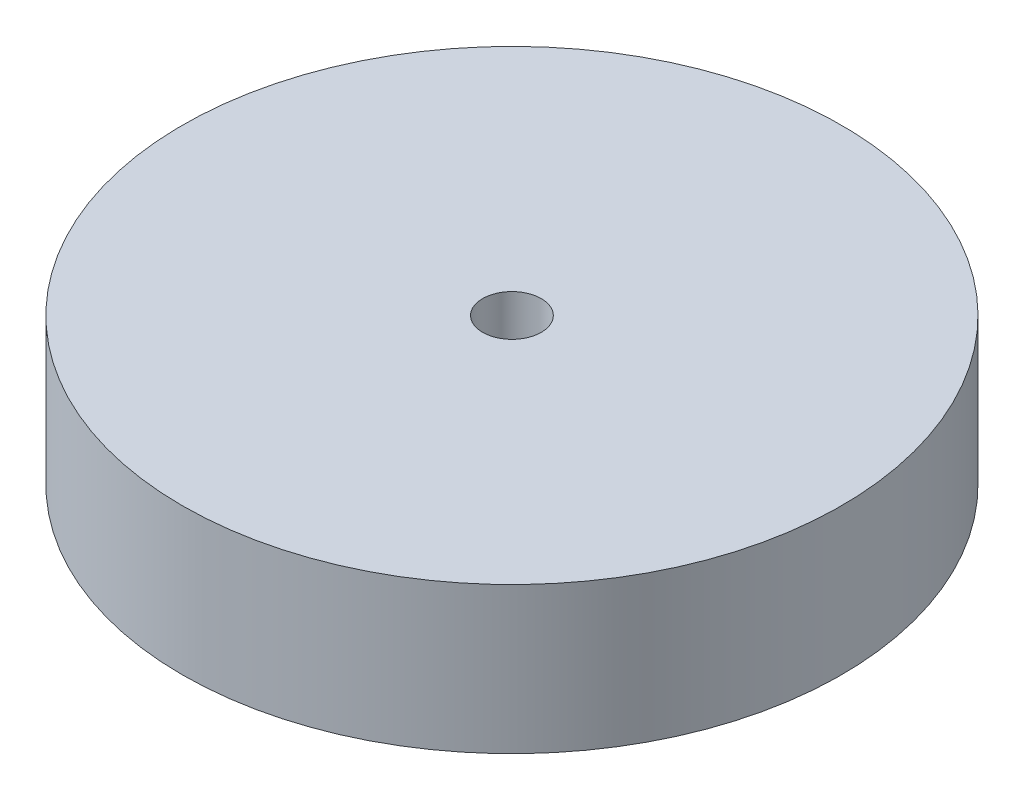
ISO-10303-21;
HEADER;
FILE_DESCRIPTION(('STEP AP214'),'2;1');
FILE_NAME('part.step','',(''),(''),'','','');
FILE_SCHEMA(('AUTOMOTIVE_DESIGN { 1 0 10303 214 1 1 1 1 }'));
ENDSEC;
DATA;
#1=APPLICATION_CONTEXT('core data for automotive mechanical design processes');
#2=APPLICATION_PROTOCOL_DEFINITION('international standard','automotive_design',2000,#1);
#3=PRODUCT_CONTEXT('',#1,'mechanical');
#4=PRODUCT('Part','Part','',(#3));
#5=PRODUCT_RELATED_PRODUCT_CATEGORY('part','',(#4));
#6=PRODUCT_DEFINITION_FORMATION('','',#4);
#7=PRODUCT_DEFINITION_CONTEXT('part definition',#1,'design');
#8=PRODUCT_DEFINITION('design','',#6,#7);
#9=PRODUCT_DEFINITION_SHAPE('','',#8);
#10=(LENGTH_UNIT() NAMED_UNIT(*) SI_UNIT(.MILLI.,.METRE.));
#11=(NAMED_UNIT(*) PLANE_ANGLE_UNIT() SI_UNIT($,.RADIAN.));
#12=(NAMED_UNIT(*) SI_UNIT($,.STERADIAN.) SOLID_ANGLE_UNIT());
#13=UNCERTAINTY_MEASURE_WITH_UNIT(LENGTH_MEASURE(1.E-05),#10,'distance_accuracy_value','');
#14=(GEOMETRIC_REPRESENTATION_CONTEXT(3) GLOBAL_UNCERTAINTY_ASSIGNED_CONTEXT((#13)) GLOBAL_UNIT_ASSIGNED_CONTEXT((#10,
#11,#12)) REPRESENTATION_CONTEXT('',''));
#15=CARTESIAN_POINT('',(0.,0.,0.));
#16=DIRECTION('',(0.,0.,1.));
#17=DIRECTION('',(1.,0.,0.));
#18=AXIS2_PLACEMENT_3D('',#15,#16,#17);
#19=CARTESIAN_POINT('',(0.,20.,0.));
#20=DIRECTION('',(0.,-1.,0.));
#21=DIRECTION('',(0.,0.,-1.));
#22=AXIS2_PLACEMENT_3D('',#19,#20,#21);
#23=CYLINDRICAL_SURFACE('',#22,45.);
#24=CARTESIAN_POINT('',(0.,20.,0.));
#25=DIRECTION('',(0.,1.,0.));
#26=DIRECTION('',(0.,0.,1.));
#27=AXIS2_PLACEMENT_3D('',#24,#25,#26);
#28=CIRCLE('',#27,45.);
#29=CARTESIAN_POINT('',(0.,20.,45.));
#30=VERTEX_POINT('',#29);
#31=EDGE_CURVE('E10',#30,#30,#28,.T.);
#32=ORIENTED_EDGE('',*,*,#31,.F.);
#33=EDGE_LOOP('',(#32));
#34=FACE_BOUND('',#33,.T.);
#35=CARTESIAN_POINT('',(0.,0.,0.));
#36=DIRECTION('',(0.,1.,0.));
#37=DIRECTION('',(0.,0.,1.));
#38=AXIS2_PLACEMENT_3D('',#35,#36,#37);
#39=CIRCLE('',#38,45.);
#40=CARTESIAN_POINT('',(0.,0.,45.));
#41=VERTEX_POINT('',#40);
#42=EDGE_CURVE('E34',#41,#41,#39,.T.);
#43=ORIENTED_EDGE('',*,*,#42,.T.);
#44=EDGE_LOOP('',(#43));
#45=FACE_BOUND('',#44,.T.);
#46=ADVANCED_FACE('F31',(#34,#45),#23,.T.);
#47=CARTESIAN_POINT('',(0.,20.,0.));
#48=DIRECTION('',(0.,1.,0.));
#49=DIRECTION('',(0.,0.,1.));
#50=AXIS2_PLACEMENT_3D('',#47,#48,#49);
#51=PLANE('',#50);
#52=CARTESIAN_POINT('',(0.,20.,0.));
#53=DIRECTION('',(0.,1.,0.));
#54=DIRECTION('',(0.,0.,1.));
#55=AXIS2_PLACEMENT_3D('',#52,#53,#54);
#56=CIRCLE('',#55,4.);
#57=CARTESIAN_POINT('',(0.,20.,4.));
#58=VERTEX_POINT('',#57);
#59=EDGE_CURVE('E45',#58,#58,#56,.T.);
#60=ORIENTED_EDGE('',*,*,#59,.F.);
#61=EDGE_LOOP('',(#60));
#62=FACE_BOUND('',#61,.T.);
#63=ORIENTED_EDGE('',*,*,#31,.T.);
#64=EDGE_LOOP('',(#63));
#65=FACE_BOUND('',#64,.T.);
#66=ADVANCED_FACE('F52',(#62,#65),#51,.T.);
#67=CARTESIAN_POINT('',(0.,0.,0.));
#68=DIRECTION('',(0.,1.,0.));
#69=DIRECTION('',(0.,0.,1.));
#70=AXIS2_PLACEMENT_3D('',#67,#68,#69);
#71=PLANE('',#70);
#72=CARTESIAN_POINT('',(0.,0.,0.));
#73=DIRECTION('',(0.,1.,0.));
#74=DIRECTION('',(0.,0.,1.));
#75=AXIS2_PLACEMENT_3D('',#72,#73,#74);
#76=CIRCLE('',#75,4.);
#77=CARTESIAN_POINT('',(0.,0.,4.));
#78=VERTEX_POINT('',#77);
#79=EDGE_CURVE('E41',#78,#78,#76,.F.);
#80=ORIENTED_EDGE('',*,*,#79,.F.);
#81=EDGE_LOOP('',(#80));
#82=FACE_BOUND('',#81,.T.);
#83=ORIENTED_EDGE('',*,*,#42,.F.);
#84=EDGE_LOOP('',(#83));
#85=FACE_BOUND('',#84,.T.);
#86=ADVANCED_FACE('F54',(#82,#85),#71,.F.);
#87=CARTESIAN_POINT('',(0.,-0.001000000000001,0.));
#88=DIRECTION('',(0.,1.,0.));
#89=DIRECTION('',(0.,0.,1.));
#90=AXIS2_PLACEMENT_3D('',#87,#88,#89);
#91=CYLINDRICAL_SURFACE('',#90,4.);
#92=ORIENTED_EDGE('',*,*,#59,.T.);
#93=EDGE_LOOP('',(#92));
#94=FACE_BOUND('',#93,.T.);
#95=ORIENTED_EDGE('',*,*,#79,.T.);
#96=EDGE_LOOP('',(#95));
#97=FACE_BOUND('',#96,.T.);
#98=ADVANCED_FACE('F49',(#94,#97),#91,.F.);
#99=CLOSED_SHELL('',(#46,#66,#86,#98));
#100=MANIFOLD_SOLID_BREP('B2',#99);
#101=ADVANCED_BREP_SHAPE_REPRESENTATION('',(#18,#100),#14);
#102=SHAPE_DEFINITION_REPRESENTATION(#9,#101);
ENDSEC;
END-ISO-10303-21;
